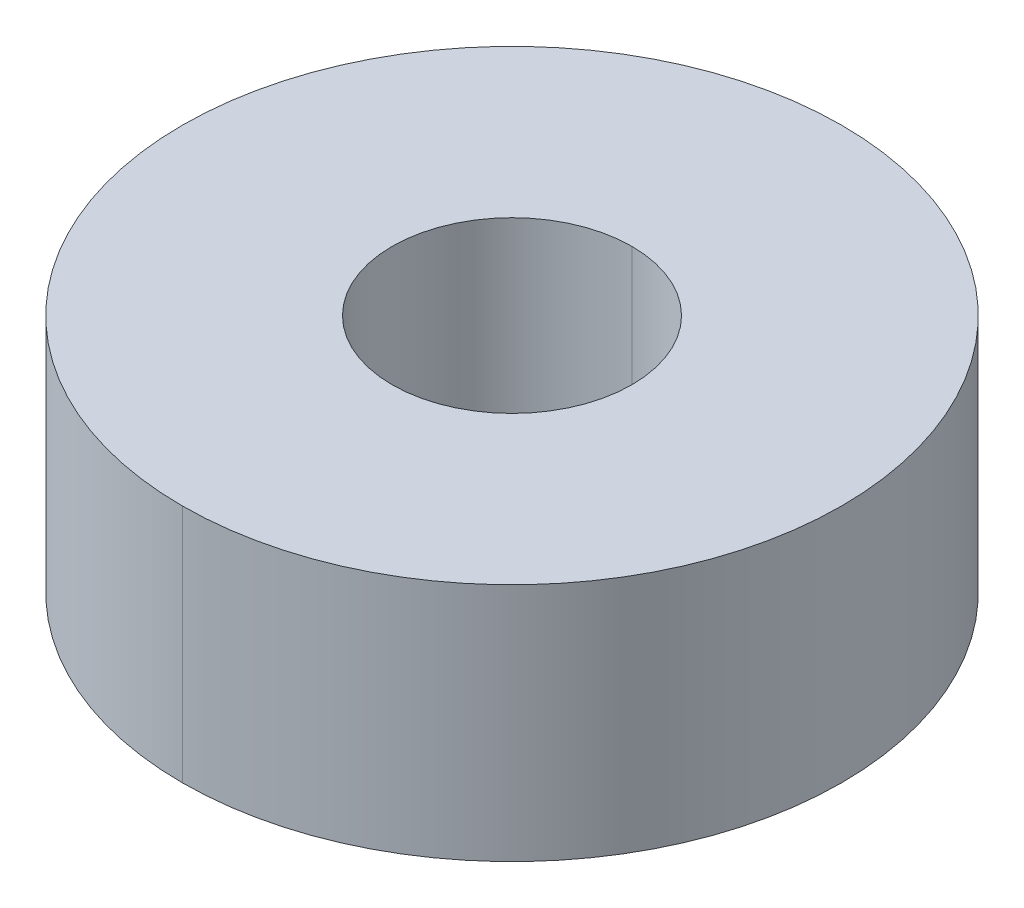
ISO-10303-21;
HEADER;
FILE_DESCRIPTION(('STEP AP214'),'2;1');
FILE_NAME('part.step','',(''),(''),'','','');
FILE_SCHEMA(('AUTOMOTIVE_DESIGN { 1 0 10303 214 1 1 1 1 }'));
ENDSEC;
DATA;
#1=APPLICATION_CONTEXT('core data for automotive mechanical design processes');
#2=APPLICATION_PROTOCOL_DEFINITION('international standard','automotive_design',2000,#1);
#3=PRODUCT_CONTEXT('',#1,'mechanical');
#4=PRODUCT('Part','Part','',(#3));
#5=PRODUCT_RELATED_PRODUCT_CATEGORY('part','',(#4));
#6=PRODUCT_DEFINITION_FORMATION('','',#4);
#7=PRODUCT_DEFINITION_CONTEXT('part definition',#1,'design');
#8=PRODUCT_DEFINITION('design','',#6,#7);
#9=PRODUCT_DEFINITION_SHAPE('','',#8);
#10=(LENGTH_UNIT() NAMED_UNIT(*) SI_UNIT(.MILLI.,.METRE.));
#11=(NAMED_UNIT(*) PLANE_ANGLE_UNIT() SI_UNIT($,.RADIAN.));
#12=(NAMED_UNIT(*) SI_UNIT($,.STERADIAN.) SOLID_ANGLE_UNIT());
#13=UNCERTAINTY_MEASURE_WITH_UNIT(LENGTH_MEASURE(1.E-05),#10,'distance_accuracy_value','');
#14=(GEOMETRIC_REPRESENTATION_CONTEXT(3) GLOBAL_UNCERTAINTY_ASSIGNED_CONTEXT((#13)) GLOBAL_UNIT_ASSIGNED_CONTEXT((#10,
#11,#12)) REPRESENTATION_CONTEXT('',''));
#15=CARTESIAN_POINT('',(0.,0.,0.));
#16=DIRECTION('',(0.,0.,1.));
#17=DIRECTION('',(1.,0.,0.));
#18=AXIS2_PLACEMENT_3D('',#15,#16,#17);
#19=CARTESIAN_POINT('',(0.,4.,0.));
#20=DIRECTION('',(0.,-1.,0.));
#21=DIRECTION('',(0.,0.,-1.));
#22=AXIS2_PLACEMENT_3D('',#19,#20,#21);
#23=CYLINDRICAL_SURFACE('',#22,2.);
#24=DIRECTION('',(0.,-1.,0.));
#25=VECTOR('',#24,1.);
#26=CARTESIAN_POINT('',(0.,4.,2.));
#27=LINE('',#26,#25);
#28=CARTESIAN_POINT('',(0.,4.,2.));
#29=VERTEX_POINT('',#28);
#30=CARTESIAN_POINT('',(0.,0.,2.));
#31=VERTEX_POINT('',#30);
#32=EDGE_CURVE('E108',#29,#31,#27,.T.);
#33=ORIENTED_EDGE('',*,*,#32,.F.);
#34=CARTESIAN_POINT('',(0.,4.,0.));
#35=DIRECTION('',(0.,1.,0.));
#36=DIRECTION('',(0.,0.,1.));
#37=AXIS2_PLACEMENT_3D('',#34,#35,#36);
#38=CIRCLE('',#37,2.);
#39=CARTESIAN_POINT('',(0.,4.,-2.));
#40=VERTEX_POINT('',#39);
#41=EDGE_CURVE('E74',#29,#40,#38,.T.);
#42=ORIENTED_EDGE('',*,*,#41,.T.);
#43=DIRECTION('',(0.,-1.,0.));
#44=VECTOR('',#43,1.);
#45=CARTESIAN_POINT('',(0.,4.,-2.));
#46=LINE('',#45,#44);
#47=CARTESIAN_POINT('',(0.,0.,-2.));
#48=VERTEX_POINT('',#47);
#49=EDGE_CURVE('E87',#40,#48,#46,.T.);
#50=ORIENTED_EDGE('',*,*,#49,.T.);
#51=CARTESIAN_POINT('',(0.,0.,0.));
#52=DIRECTION('',(0.,1.,0.));
#53=DIRECTION('',(0.,0.,1.));
#54=AXIS2_PLACEMENT_3D('',#51,#52,#53);
#55=CIRCLE('',#54,2.);
#56=EDGE_CURVE('E11',#31,#48,#55,.T.);
#57=ORIENTED_EDGE('',*,*,#56,.F.);
#58=EDGE_LOOP('',(#33,#42,#50,#57));
#59=FACE_BOUND('',#58,.T.);
#60=ADVANCED_FACE('F17',(#59),#23,.F.);
#61=CARTESIAN_POINT('',(0.,4.,0.));
#62=DIRECTION('',(0.,-1.,0.));
#63=DIRECTION('',(0.,0.,-1.));
#64=AXIS2_PLACEMENT_3D('',#61,#62,#63);
#65=CYLINDRICAL_SURFACE('',#64,5.5);
#66=DIRECTION('',(0.,-1.,0.));
#67=VECTOR('',#66,1.);
#68=CARTESIAN_POINT('',(0.,4.,5.5));
#69=LINE('',#68,#67);
#70=CARTESIAN_POINT('',(0.,4.,5.5));
#71=VERTEX_POINT('',#70);
#72=CARTESIAN_POINT('',(0.,0.,5.5));
#73=VERTEX_POINT('',#72);
#74=EDGE_CURVE('E78',#71,#73,#69,.T.);
#75=ORIENTED_EDGE('',*,*,#74,.F.);
#76=CARTESIAN_POINT('',(0.,4.,0.));
#77=DIRECTION('',(0.,1.,0.));
#78=DIRECTION('',(0.,0.,1.));
#79=AXIS2_PLACEMENT_3D('',#76,#77,#78);
#80=CIRCLE('',#79,5.5);
#81=CARTESIAN_POINT('',(0.,4.,-5.5));
#82=VERTEX_POINT('',#81);
#83=EDGE_CURVE('E68',#82,#71,#80,.T.);
#84=ORIENTED_EDGE('',*,*,#83,.F.);
#85=DIRECTION('',(0.,-1.,0.));
#86=VECTOR('',#85,1.);
#87=CARTESIAN_POINT('',(0.,4.,-5.5));
#88=LINE('',#87,#86);
#89=CARTESIAN_POINT('',(0.,0.,-5.5));
#90=VERTEX_POINT('',#89);
#91=EDGE_CURVE('E75',#82,#90,#88,.T.);
#92=ORIENTED_EDGE('',*,*,#91,.T.);
#93=CARTESIAN_POINT('',(0.,0.,0.));
#94=DIRECTION('',(0.,1.,0.));
#95=DIRECTION('',(0.,0.,1.));
#96=AXIS2_PLACEMENT_3D('',#93,#94,#95);
#97=CIRCLE('',#96,5.5);
#98=EDGE_CURVE('E25',#90,#73,#97,.T.);
#99=ORIENTED_EDGE('',*,*,#98,.T.);
#100=EDGE_LOOP('',(#75,#84,#92,#99));
#101=FACE_BOUND('',#100,.T.);
#102=ADVANCED_FACE('F79',(#101),#65,.T.);
#103=CARTESIAN_POINT('',(0.,0.,0.));
#104=DIRECTION('',(0.,1.,0.));
#105=DIRECTION('',(1.,0.,0.));
#106=AXIS2_PLACEMENT_3D('',#103,#104,#105);
#107=PLANE('',#106);
#108=CARTESIAN_POINT('',(0.,0.,0.));
#109=DIRECTION('',(0.,1.,0.));
#110=DIRECTION('',(0.,0.,1.));
#111=AXIS2_PLACEMENT_3D('',#108,#109,#110);
#112=CIRCLE('',#111,2.);
#113=EDGE_CURVE('E94',#48,#31,#112,.T.);
#114=ORIENTED_EDGE('',*,*,#113,.T.);
#115=ORIENTED_EDGE('',*,*,#56,.T.);
#116=EDGE_LOOP('',(#114,#115));
#117=FACE_BOUND('',#116,.T.);
#118=ORIENTED_EDGE('',*,*,#98,.F.);
#119=CARTESIAN_POINT('',(0.,0.,0.));
#120=DIRECTION('',(0.,1.,0.));
#121=DIRECTION('',(0.,0.,1.));
#122=AXIS2_PLACEMENT_3D('',#119,#120,#121);
#123=CIRCLE('',#122,5.5);
#124=EDGE_CURVE('E83',#73,#90,#123,.T.);
#125=ORIENTED_EDGE('',*,*,#124,.F.);
#126=EDGE_LOOP('',(#118,#125));
#127=FACE_BOUND('',#126,.T.);
#128=ADVANCED_FACE('F130',(#117,#127),#107,.F.);
#129=CARTESIAN_POINT('',(0.,4.,0.));
#130=DIRECTION('',(0.,1.,0.));
#131=DIRECTION('',(1.,0.,0.));
#132=AXIS2_PLACEMENT_3D('',#129,#130,#131);
#133=PLANE('',#132);
#134=CARTESIAN_POINT('',(0.,4.,0.));
#135=DIRECTION('',(0.,1.,0.));
#136=DIRECTION('',(0.,0.,1.));
#137=AXIS2_PLACEMENT_3D('',#134,#135,#136);
#138=CIRCLE('',#137,2.);
#139=EDGE_CURVE('E114',#40,#29,#138,.T.);
#140=ORIENTED_EDGE('',*,*,#139,.F.);
#141=ORIENTED_EDGE('',*,*,#41,.F.);
#142=EDGE_LOOP('',(#140,#141));
#143=FACE_BOUND('',#142,.T.);
#144=ORIENTED_EDGE('',*,*,#83,.T.);
#145=CARTESIAN_POINT('',(0.,4.,0.));
#146=DIRECTION('',(0.,1.,0.));
#147=DIRECTION('',(0.,0.,1.));
#148=AXIS2_PLACEMENT_3D('',#145,#146,#147);
#149=CIRCLE('',#148,5.5);
#150=EDGE_CURVE('E71',#71,#82,#149,.T.);
#151=ORIENTED_EDGE('',*,*,#150,.T.);
#152=EDGE_LOOP('',(#144,#151));
#153=FACE_BOUND('',#152,.T.);
#154=ADVANCED_FACE('F69',(#143,#153),#133,.T.);
#155=CARTESIAN_POINT('',(0.,4.,0.));
#156=DIRECTION('',(0.,-1.,0.));
#157=DIRECTION('',(0.,0.,-1.));
#158=AXIS2_PLACEMENT_3D('',#155,#156,#157);
#159=CYLINDRICAL_SURFACE('',#158,5.5);
#160=ORIENTED_EDGE('',*,*,#150,.F.);
#161=ORIENTED_EDGE('',*,*,#74,.T.);
#162=ORIENTED_EDGE('',*,*,#124,.T.);
#163=ORIENTED_EDGE('',*,*,#91,.F.);
#164=EDGE_LOOP('',(#160,#161,#162,#163));
#165=FACE_BOUND('',#164,.T.);
#166=ADVANCED_FACE('F85',(#165),#159,.T.);
#167=CARTESIAN_POINT('',(0.,4.,0.));
#168=DIRECTION('',(0.,-1.,0.));
#169=DIRECTION('',(0.,0.,-1.));
#170=AXIS2_PLACEMENT_3D('',#167,#168,#169);
#171=CYLINDRICAL_SURFACE('',#170,2.);
#172=ORIENTED_EDGE('',*,*,#139,.T.);
#173=ORIENTED_EDGE('',*,*,#32,.T.);
#174=ORIENTED_EDGE('',*,*,#113,.F.);
#175=ORIENTED_EDGE('',*,*,#49,.F.);
#176=EDGE_LOOP('',(#172,#173,#174,#175));
#177=FACE_BOUND('',#176,.T.);
#178=ADVANCED_FACE('F113',(#177),#171,.F.);
#179=CLOSED_SHELL('',(#60,#102,#128,#154,#166,#178));
#180=MANIFOLD_SOLID_BREP('B1',#179);
#181=ADVANCED_BREP_SHAPE_REPRESENTATION('',(#18,#180),#14);
#182=SHAPE_DEFINITION_REPRESENTATION(#9,#181);
ENDSEC;
END-ISO-10303-21;
